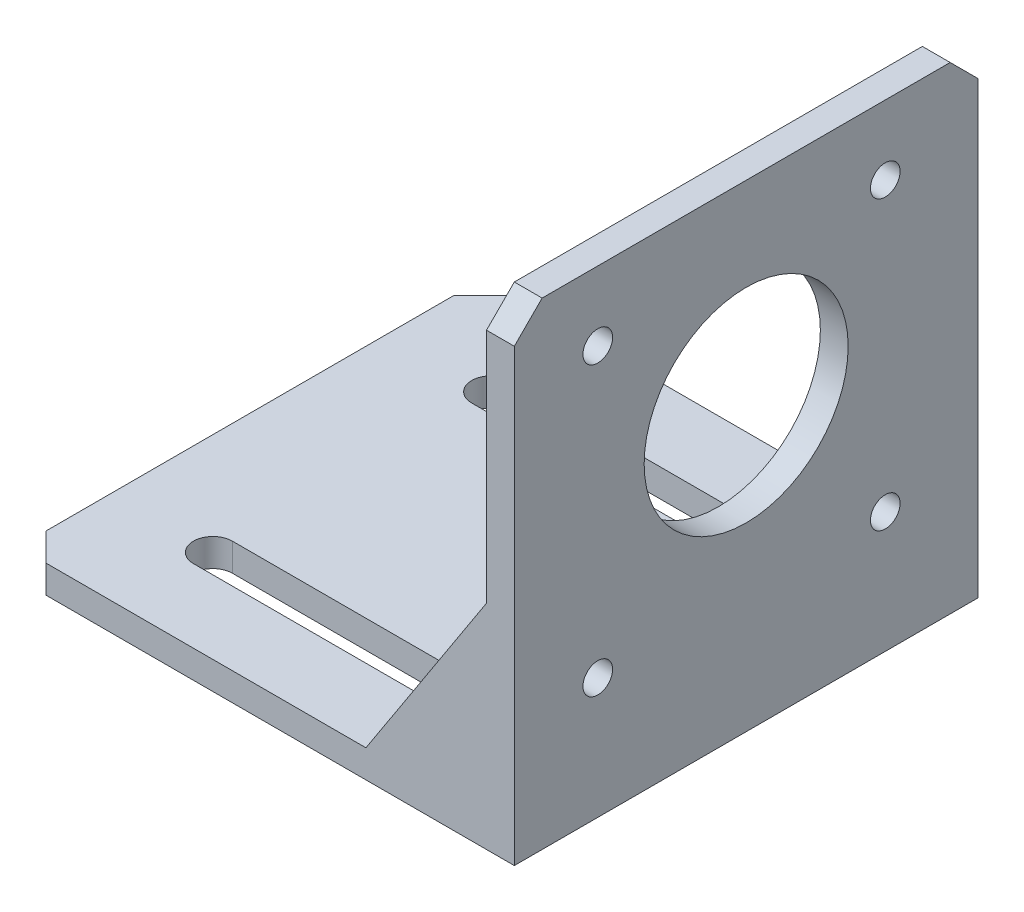
ISO-10303-21;
HEADER;
FILE_DESCRIPTION(('STEP AP214'),'2;1');
FILE_NAME('part.step','',(''),(''),'','','');
FILE_SCHEMA(('AUTOMOTIVE_DESIGN { 1 0 10303 214 1 1 1 1 }'));
ENDSEC;
DATA;
#1=APPLICATION_CONTEXT('core data for automotive mechanical design processes');
#2=APPLICATION_PROTOCOL_DEFINITION('international standard','automotive_design',2000,#1);
#3=PRODUCT_CONTEXT('',#1,'mechanical');
#4=PRODUCT('Part','Part','',(#3));
#5=PRODUCT_RELATED_PRODUCT_CATEGORY('part','',(#4));
#6=PRODUCT_DEFINITION_FORMATION('','',#4);
#7=PRODUCT_DEFINITION_CONTEXT('part definition',#1,'design');
#8=PRODUCT_DEFINITION('design','',#6,#7);
#9=PRODUCT_DEFINITION_SHAPE('','',#8);
#10=(LENGTH_UNIT() NAMED_UNIT(*) SI_UNIT(.MILLI.,.METRE.));
#11=(NAMED_UNIT(*) PLANE_ANGLE_UNIT() SI_UNIT($,.RADIAN.));
#12=(NAMED_UNIT(*) SI_UNIT($,.STERADIAN.) SOLID_ANGLE_UNIT());
#13=UNCERTAINTY_MEASURE_WITH_UNIT(LENGTH_MEASURE(1.E-05),#10,'distance_accuracy_value','');
#14=(GEOMETRIC_REPRESENTATION_CONTEXT(3) GLOBAL_UNCERTAINTY_ASSIGNED_CONTEXT((#13)) GLOBAL_UNIT_ASSIGNED_CONTEXT((#10,
#11,#12)) REPRESENTATION_CONTEXT('',''));
#15=CARTESIAN_POINT('',(0.,0.,0.));
#16=DIRECTION('',(0.,0.,1.));
#17=DIRECTION('',(1.,0.,0.));
#18=AXIS2_PLACEMENT_3D('',#15,#16,#17);
#19=CARTESIAN_POINT('',(0.,0.,50.));
#20=DIRECTION('',(0.,-1.,0.));
#21=DIRECTION('',(0.,0.,-1.));
#22=AXIS2_PLACEMENT_3D('',#19,#20,#21);
#23=PLANE('',#22);
#24=DIRECTION('',(-1.,0.,0.));
#25=VECTOR('',#24,1.);
#26=CARTESIAN_POINT('',(0.,0.,0.));
#27=LINE('',#26,#25);
#28=CARTESIAN_POINT('',(37.5,0.,0.));
#29=VERTEX_POINT('',#28);
#30=CARTESIAN_POINT('',(3.00000000000002,0.,0.));
#31=VERTEX_POINT('',#30);
#32=EDGE_CURVE('E440',#29,#31,#27,.T.);
#33=ORIENTED_EDGE('',*,*,#32,.T.);
#34=DIRECTION('',(-0.707106781186549,0.,0.707106781186546));
#35=VECTOR('',#34,1.);
#36=CARTESIAN_POINT('',(0.,0.,3.));
#37=LINE('',#36,#35);
#38=CARTESIAN_POINT('',(0.,0.,3.));
#39=VERTEX_POINT('',#38);
#40=EDGE_CURVE('E511',#31,#39,#37,.T.);
#41=ORIENTED_EDGE('',*,*,#40,.T.);
#42=DIRECTION('',(0.,0.,-1.));
#43=VECTOR('',#42,1.);
#44=CARTESIAN_POINT('',(0.,0.,50.));
#45=LINE('',#44,#43);
#46=CARTESIAN_POINT('',(0.,0.,47.));
#47=VERTEX_POINT('',#46);
#48=EDGE_CURVE('E443',#47,#39,#45,.T.);
#49=ORIENTED_EDGE('',*,*,#48,.F.);
#50=DIRECTION('',(-0.707106781186546,0.,-0.707106781186549));
#51=VECTOR('',#50,1.);
#52=CARTESIAN_POINT('',(3.,0.,50.));
#53=LINE('',#52,#51);
#54=CARTESIAN_POINT('',(3.,0.,50.));
#55=VERTEX_POINT('',#54);
#56=EDGE_CURVE('E509',#47,#55,#53,.F.);
#57=ORIENTED_EDGE('',*,*,#56,.T.);
#58=DIRECTION('',(-1.,0.,0.));
#59=VECTOR('',#58,1.);
#60=CARTESIAN_POINT('',(0.,0.,50.));
#61=LINE('',#60,#59);
#62=CARTESIAN_POINT('',(37.5,0.,50.));
#63=VERTEX_POINT('',#62);
#64=EDGE_CURVE('E347',#63,#55,#61,.T.);
#65=ORIENTED_EDGE('',*,*,#64,.F.);
#66=DIRECTION('',(0.,0.,-1.));
#67=VECTOR('',#66,1.);
#68=CARTESIAN_POINT('',(37.5,0.,50.));
#69=LINE('',#68,#67);
#70=CARTESIAN_POINT('',(37.5,0.,47.9));
#71=VERTEX_POINT('',#70);
#72=EDGE_CURVE('E356',#63,#71,#69,.T.);
#73=ORIENTED_EDGE('',*,*,#72,.T.);
#74=DIRECTION('',(-1.,0.,0.));
#75=VECTOR('',#74,1.);
#76=CARTESIAN_POINT('',(0.,0.,47.9));
#77=LINE('',#76,#75);
#78=CARTESIAN_POINT('',(50.5,0.,47.9));
#79=VERTEX_POINT('',#78);
#80=EDGE_CURVE('E371',#79,#71,#77,.T.);
#81=ORIENTED_EDGE('',*,*,#80,.F.);
#82=DIRECTION('',(0.,0.,-1.));
#83=VECTOR('',#82,1.);
#84=CARTESIAN_POINT('',(50.5,0.,50.));
#85=LINE('',#84,#83);
#86=CARTESIAN_POINT('',(50.5,0.,2.1));
#87=VERTEX_POINT('',#86);
#88=EDGE_CURVE('E453',#79,#87,#85,.T.);
#89=ORIENTED_EDGE('',*,*,#88,.T.);
#90=DIRECTION('',(1.,0.,0.));
#91=VECTOR('',#90,1.);
#92=CARTESIAN_POINT('',(0.,0.,2.1));
#93=LINE('',#92,#91);
#94=CARTESIAN_POINT('',(37.5,0.,2.1));
#95=VERTEX_POINT('',#94);
#96=EDGE_CURVE('E560',#95,#87,#93,.T.);
#97=ORIENTED_EDGE('',*,*,#96,.F.);
#98=DIRECTION('',(0.,0.,1.));
#99=VECTOR('',#98,1.);
#100=CARTESIAN_POINT('',(37.5,0.,50.));
#101=LINE('',#100,#99);
#102=EDGE_CURVE('E551',#95,#29,#101,.F.);
#103=ORIENTED_EDGE('',*,*,#102,.T.);
#104=EDGE_LOOP('',(#33,#41,#49,#57,#65,#73,#81,#89,#97,#103));
#105=FACE_BOUND('',#104,.T.);
#106=CARTESIAN_POINT('',(41.,0.,40.));
#107=DIRECTION('',(0.,1.,0.));
#108=DIRECTION('',(0.,0.,1.));
#109=AXIS2_PLACEMENT_3D('',#106,#107,#108);
#110=CIRCLE('',#109,2.1);
#111=CARTESIAN_POINT('',(41.,0.,42.1));
#112=VERTEX_POINT('',#111);
#113=CARTESIAN_POINT('',(41.,0.,37.9));
#114=VERTEX_POINT('',#113);
#115=EDGE_CURVE('E406',#112,#114,#110,.T.);
#116=ORIENTED_EDGE('',*,*,#115,.F.);
#117=DIRECTION('',(1.,0.,0.));
#118=VECTOR('',#117,1.);
#119=CARTESIAN_POINT('',(11.,0.,42.1));
#120=LINE('',#119,#118);
#121=CARTESIAN_POINT('',(11.,0.,42.1));
#122=VERTEX_POINT('',#121);
#123=EDGE_CURVE('E393',#122,#112,#120,.T.);
#124=ORIENTED_EDGE('',*,*,#123,.F.);
#125=CARTESIAN_POINT('',(11.,0.,40.));
#126=DIRECTION('',(0.,1.,0.));
#127=DIRECTION('',(0.,0.,1.));
#128=AXIS2_PLACEMENT_3D('',#125,#126,#127);
#129=CIRCLE('',#128,2.1);
#130=CARTESIAN_POINT('',(11.,0.,37.9));
#131=VERTEX_POINT('',#130);
#132=EDGE_CURVE('E398',#131,#122,#129,.T.);
#133=ORIENTED_EDGE('',*,*,#132,.F.);
#134=DIRECTION('',(1.,0.,0.));
#135=VECTOR('',#134,1.);
#136=CARTESIAN_POINT('',(11.,0.,37.9));
#137=LINE('',#136,#135);
#138=EDGE_CURVE('E395',#131,#114,#137,.T.);
#139=ORIENTED_EDGE('',*,*,#138,.T.);
#140=EDGE_LOOP('',(#116,#124,#133,#139));
#141=FACE_BOUND('',#140,.T.);
#142=DIRECTION('',(1.,0.,0.));
#143=VECTOR('',#142,1.);
#144=CARTESIAN_POINT('',(11.,0.,12.1));
#145=LINE('',#144,#143);
#146=CARTESIAN_POINT('',(11.,0.,12.1));
#147=VERTEX_POINT('',#146);
#148=CARTESIAN_POINT('',(41.,0.,12.1));
#149=VERTEX_POINT('',#148);
#150=EDGE_CURVE('E373',#147,#149,#145,.T.);
#151=ORIENTED_EDGE('',*,*,#150,.F.);
#152=CARTESIAN_POINT('',(11.,0.,10.));
#153=DIRECTION('',(0.,1.,0.));
#154=DIRECTION('',(0.,0.,1.));
#155=AXIS2_PLACEMENT_3D('',#152,#153,#154);
#156=CIRCLE('',#155,2.1);
#157=CARTESIAN_POINT('',(11.,0.,7.9));
#158=VERTEX_POINT('',#157);
#159=EDGE_CURVE('E378',#158,#147,#156,.T.);
#160=ORIENTED_EDGE('',*,*,#159,.F.);
#161=DIRECTION('',(1.,0.,0.));
#162=VECTOR('',#161,1.);
#163=CARTESIAN_POINT('',(11.,0.,7.9));
#164=LINE('',#163,#162);
#165=CARTESIAN_POINT('',(41.,0.,7.9));
#166=VERTEX_POINT('',#165);
#167=EDGE_CURVE('E375',#158,#166,#164,.T.);
#168=ORIENTED_EDGE('',*,*,#167,.T.);
#169=CARTESIAN_POINT('',(41.,0.,10.));
#170=DIRECTION('',(0.,1.,0.));
#171=DIRECTION('',(0.,0.,1.));
#172=AXIS2_PLACEMENT_3D('',#169,#170,#171);
#173=CIRCLE('',#172,2.1);
#174=EDGE_CURVE('E386',#149,#166,#173,.T.);
#175=ORIENTED_EDGE('',*,*,#174,.F.);
#176=EDGE_LOOP('',(#151,#160,#168,#175));
#177=FACE_BOUND('',#176,.T.);
#178=ADVANCED_FACE('F186',(#105,#141,#177),#23,.F.);
#179=CARTESIAN_POINT('',(50.5,0.,50.));
#180=DIRECTION('',(1.,0.,0.));
#181=DIRECTION('',(0.,0.,-1.));
#182=AXIS2_PLACEMENT_3D('',#179,#180,#181);
#183=PLANE('',#182);
#184=CARTESIAN_POINT('',(50.5,41.0348020434226,10.));
#185=DIRECTION('',(-1.,0.,0.));
#186=DIRECTION('',(0.,0.,1.));
#187=AXIS2_PLACEMENT_3D('',#184,#185,#186);
#188=CIRCLE('',#187,1.60000000000001);
#189=CARTESIAN_POINT('',(50.5,41.0348020434226,11.6));
#190=VERTEX_POINT('',#189);
#191=EDGE_CURVE('E413',#190,#190,#188,.T.);
#192=ORIENTED_EDGE('',*,*,#191,.F.);
#193=EDGE_LOOP('',(#192));
#194=FACE_BOUND('',#193,.T.);
#195=CARTESIAN_POINT('',(50.5,41.0348020434226,41.));
#196=DIRECTION('',(-1.,0.,0.));
#197=DIRECTION('',(0.,0.,1.));
#198=AXIS2_PLACEMENT_3D('',#195,#196,#197);
#199=CIRCLE('',#198,1.60000000000001);
#200=CARTESIAN_POINT('',(50.5,41.0348020434226,42.6));
#201=VERTEX_POINT('',#200);
#202=EDGE_CURVE('E417',#201,#201,#199,.T.);
#203=ORIENTED_EDGE('',*,*,#202,.F.);
#204=EDGE_LOOP('',(#203));
#205=FACE_BOUND('',#204,.T.);
#206=CARTESIAN_POINT('',(50.5,10.0348020434226,41.));
#207=DIRECTION('',(-1.,0.,0.));
#208=DIRECTION('',(0.,0.,1.));
#209=AXIS2_PLACEMENT_3D('',#206,#207,#208);
#210=CIRCLE('',#209,1.60000000000001);
#211=CARTESIAN_POINT('',(50.5,10.0348020434226,42.6));
#212=VERTEX_POINT('',#211);
#213=EDGE_CURVE('E421',#212,#212,#210,.T.);
#214=ORIENTED_EDGE('',*,*,#213,.F.);
#215=EDGE_LOOP('',(#214));
#216=FACE_BOUND('',#215,.T.);
#217=CARTESIAN_POINT('',(50.5,27.5,25.));
#218=DIRECTION('',(-1.,0.,0.));
#219=DIRECTION('',(0.,0.,1.));
#220=AXIS2_PLACEMENT_3D('',#217,#218,#219);
#221=CIRCLE('',#220,11.);
#222=CARTESIAN_POINT('',(50.5,27.5,36.));
#223=VERTEX_POINT('',#222);
#224=EDGE_CURVE('E431',#223,#223,#221,.T.);
#225=ORIENTED_EDGE('',*,*,#224,.F.);
#226=EDGE_LOOP('',(#225));
#227=FACE_BOUND('',#226,.T.);
#228=DIRECTION('',(0.,0.,-1.));
#229=VECTOR('',#228,1.);
#230=CARTESIAN_POINT('',(50.5,48.5,50.));
#231=LINE('',#230,#229);
#232=CARTESIAN_POINT('',(50.5,48.5,47.));
#233=VERTEX_POINT('',#232);
#234=CARTESIAN_POINT('',(50.5,48.5,3.));
#235=VERTEX_POINT('',#234);
#236=EDGE_CURVE('E456',#233,#235,#231,.T.);
#237=ORIENTED_EDGE('',*,*,#236,.T.);
#238=DIRECTION('',(0.,-0.707106781186549,-0.707106781186546));
#239=VECTOR('',#238,1.);
#240=CARTESIAN_POINT('',(50.5,48.5,3.));
#241=LINE('',#240,#239);
#242=CARTESIAN_POINT('',(50.5,45.5,0.));
#243=VERTEX_POINT('',#242);
#244=EDGE_CURVE('E523',#235,#243,#241,.T.);
#245=ORIENTED_EDGE('',*,*,#244,.T.);
#246=DIRECTION('',(0.,-1.,0.));
#247=VECTOR('',#246,1.);
#248=CARTESIAN_POINT('',(50.5,0.,0.));
#249=LINE('',#248,#247);
#250=CARTESIAN_POINT('',(50.5,20.,0.));
#251=VERTEX_POINT('',#250);
#252=EDGE_CURVE('E447',#243,#251,#249,.T.);
#253=ORIENTED_EDGE('',*,*,#252,.T.);
#254=DIRECTION('',(0.,0.,-1.));
#255=VECTOR('',#254,1.);
#256=CARTESIAN_POINT('',(50.5,20.,50.));
#257=LINE('',#256,#255);
#258=CARTESIAN_POINT('',(50.5,20.,2.1));
#259=VERTEX_POINT('',#258);
#260=EDGE_CURVE('E548',#251,#259,#257,.F.);
#261=ORIENTED_EDGE('',*,*,#260,.T.);
#262=DIRECTION('',(0.,1.,0.));
#263=VECTOR('',#262,1.);
#264=CARTESIAN_POINT('',(50.5,0.,2.1));
#265=LINE('',#264,#263);
#266=EDGE_CURVE('E557',#87,#259,#265,.T.);
#267=ORIENTED_EDGE('',*,*,#266,.F.);
#268=ORIENTED_EDGE('',*,*,#88,.F.);
#269=DIRECTION('',(0.,-1.,0.));
#270=VECTOR('',#269,1.);
#271=CARTESIAN_POINT('',(50.5,0.,47.9));
#272=LINE('',#271,#270);
#273=CARTESIAN_POINT('',(50.5,20.,47.9));
#274=VERTEX_POINT('',#273);
#275=EDGE_CURVE('E365',#274,#79,#272,.T.);
#276=ORIENTED_EDGE('',*,*,#275,.F.);
#277=DIRECTION('',(0.,0.,1.));
#278=VECTOR('',#277,1.);
#279=CARTESIAN_POINT('',(50.5,20.,50.));
#280=LINE('',#279,#278);
#281=CARTESIAN_POINT('',(50.5,20.,50.));
#282=VERTEX_POINT('',#281);
#283=EDGE_CURVE('E353',#274,#282,#280,.T.);
#284=ORIENTED_EDGE('',*,*,#283,.T.);
#285=DIRECTION('',(0.,-1.,0.));
#286=VECTOR('',#285,1.);
#287=CARTESIAN_POINT('',(50.5,0.,50.));
#288=LINE('',#287,#286);
#289=CARTESIAN_POINT('',(50.5,45.5,50.));
#290=VERTEX_POINT('',#289);
#291=EDGE_CURVE('E336',#290,#282,#288,.T.);
#292=ORIENTED_EDGE('',*,*,#291,.F.);
#293=DIRECTION('',(0.,-0.707106781186546,0.707106781186549));
#294=VECTOR('',#293,1.);
#295=CARTESIAN_POINT('',(50.5,45.5,50.));
#296=LINE('',#295,#294);
#297=EDGE_CURVE('E521',#290,#233,#296,.F.);
#298=ORIENTED_EDGE('',*,*,#297,.T.);
#299=EDGE_LOOP('',(#237,#245,#253,#261,#267,#268,#276,#284,#292,#298));
#300=FACE_BOUND('',#299,.T.);
#301=CARTESIAN_POINT('',(50.5,10.0348020434226,10.));
#302=DIRECTION('',(-1.,0.,0.));
#303=DIRECTION('',(0.,0.,1.));
#304=AXIS2_PLACEMENT_3D('',#301,#302,#303);
#305=CIRCLE('',#304,1.60000000000001);
#306=CARTESIAN_POINT('',(50.5,10.0348020434226,11.6));
#307=VERTEX_POINT('',#306);
#308=EDGE_CURVE('E425',#307,#307,#305,.T.);
#309=ORIENTED_EDGE('',*,*,#308,.F.);
#310=EDGE_LOOP('',(#309));
#311=FACE_BOUND('',#310,.T.);
#312=ADVANCED_FACE('F362',(#194,#205,#216,#227,#300,#311),#183,.F.);
#313=CARTESIAN_POINT('',(0.,-3.,50.));
#314=DIRECTION('',(1.,0.,0.));
#315=DIRECTION('',(0.,0.,-1.));
#316=AXIS2_PLACEMENT_3D('',#313,#314,#315);
#317=PLANE('',#316);
#318=ORIENTED_EDGE('',*,*,#48,.T.);
#319=DIRECTION('',(0.,-1.,0.));
#320=VECTOR('',#319,1.);
#321=CARTESIAN_POINT('',(0.,-3.,3.));
#322=LINE('',#321,#320);
#323=CARTESIAN_POINT('',(0.,-3.,3.));
#324=VERTEX_POINT('',#323);
#325=EDGE_CURVE('E498',#39,#324,#322,.T.);
#326=ORIENTED_EDGE('',*,*,#325,.T.);
#327=DIRECTION('',(0.,0.,-1.));
#328=VECTOR('',#327,1.);
#329=CARTESIAN_POINT('',(0.,-3.,50.));
#330=LINE('',#329,#328);
#331=CARTESIAN_POINT('',(0.,-3.,47.));
#332=VERTEX_POINT('',#331);
#333=EDGE_CURVE('E463',#332,#324,#330,.T.);
#334=ORIENTED_EDGE('',*,*,#333,.F.);
#335=DIRECTION('',(0.,1.,0.));
#336=VECTOR('',#335,1.);
#337=CARTESIAN_POINT('',(0.,-3.,47.));
#338=LINE('',#337,#336);
#339=EDGE_CURVE('E496',#332,#47,#338,.T.);
#340=ORIENTED_EDGE('',*,*,#339,.T.);
#341=EDGE_LOOP('',(#318,#326,#334,#340));
#342=FACE_BOUND('',#341,.T.);
#343=ADVANCED_FACE('F578',(#342),#317,.F.);
#344=CARTESIAN_POINT('',(53.5,-2.99999999999999,50.));
#345=DIRECTION('',(0.,1.,0.));
#346=DIRECTION('',(-1.,0.,0.));
#347=AXIS2_PLACEMENT_3D('',#344,#345,#346);
#348=PLANE('',#347);
#349=ORIENTED_EDGE('',*,*,#333,.T.);
#350=DIRECTION('',(0.707106781186549,0.,-0.707106781186546));
#351=VECTOR('',#350,1.);
#352=CARTESIAN_POINT('',(0.,-3.,3.));
#353=LINE('',#352,#351);
#354=CARTESIAN_POINT('',(3.00000000000002,-3.,0.));
#355=VERTEX_POINT('',#354);
#356=EDGE_CURVE('E503',#324,#355,#353,.T.);
#357=ORIENTED_EDGE('',*,*,#356,.T.);
#358=DIRECTION('',(1.,0.,0.));
#359=VECTOR('',#358,1.);
#360=CARTESIAN_POINT('',(53.5,-2.99999999999999,0.));
#361=LINE('',#360,#359);
#362=CARTESIAN_POINT('',(53.5,-2.99999999999999,0.));
#363=VERTEX_POINT('',#362);
#364=EDGE_CURVE('E437',#355,#363,#361,.T.);
#365=ORIENTED_EDGE('',*,*,#364,.T.);
#366=DIRECTION('',(0.,0.,-1.));
#367=VECTOR('',#366,1.);
#368=CARTESIAN_POINT('',(53.5,-2.99999999999999,50.));
#369=LINE('',#368,#367);
#370=CARTESIAN_POINT('',(53.5,-2.99999999999999,50.));
#371=VERTEX_POINT('',#370);
#372=EDGE_CURVE('E460',#371,#363,#369,.T.);
#373=ORIENTED_EDGE('',*,*,#372,.F.);
#374=DIRECTION('',(1.,0.,0.));
#375=VECTOR('',#374,1.);
#376=CARTESIAN_POINT('',(53.5,-2.99999999999999,50.));
#377=LINE('',#376,#375);
#378=CARTESIAN_POINT('',(3.,-3.,50.));
#379=VERTEX_POINT('',#378);
#380=EDGE_CURVE('E438',#379,#371,#377,.T.);
#381=ORIENTED_EDGE('',*,*,#380,.F.);
#382=DIRECTION('',(0.707106781186546,0.,0.707106781186549));
#383=VECTOR('',#382,1.);
#384=CARTESIAN_POINT('',(3.,-3.,50.));
#385=LINE('',#384,#383);
#386=EDGE_CURVE('E501',#379,#332,#385,.F.);
#387=ORIENTED_EDGE('',*,*,#386,.T.);
#388=EDGE_LOOP('',(#349,#357,#365,#373,#381,#387));
#389=FACE_BOUND('',#388,.T.);
#390=CARTESIAN_POINT('',(41.,-3.,10.));
#391=DIRECTION('',(0.,1.,0.));
#392=DIRECTION('',(-1.,0.,0.));
#393=AXIS2_PLACEMENT_3D('',#390,#391,#392);
#394=CIRCLE('',#393,2.1);
#395=CARTESIAN_POINT('',(41.,-3.,12.1));
#396=VERTEX_POINT('',#395);
#397=CARTESIAN_POINT('',(41.,-3.,7.9));
#398=VERTEX_POINT('',#397);
#399=EDGE_CURVE('E490',#396,#398,#394,.T.);
#400=ORIENTED_EDGE('',*,*,#399,.T.);
#401=DIRECTION('',(-1.,0.,0.));
#402=VECTOR('',#401,1.);
#403=CARTESIAN_POINT('',(53.5,-2.99999999999999,7.9));
#404=LINE('',#403,#402);
#405=CARTESIAN_POINT('',(11.,-3.,7.9));
#406=VERTEX_POINT('',#405);
#407=EDGE_CURVE('E493',#398,#406,#404,.T.);
#408=ORIENTED_EDGE('',*,*,#407,.T.);
#409=CARTESIAN_POINT('',(11.,-3.,10.));
#410=DIRECTION('',(0.,1.,0.));
#411=DIRECTION('',(-1.,0.,0.));
#412=AXIS2_PLACEMENT_3D('',#409,#410,#411);
#413=CIRCLE('',#412,2.1);
#414=CARTESIAN_POINT('',(11.,-3.,12.1));
#415=VERTEX_POINT('',#414);
#416=EDGE_CURVE('E487',#406,#415,#413,.T.);
#417=ORIENTED_EDGE('',*,*,#416,.T.);
#418=DIRECTION('',(1.,0.,0.));
#419=VECTOR('',#418,1.);
#420=CARTESIAN_POINT('',(53.5,-2.99999999999999,12.1));
#421=LINE('',#420,#419);
#422=EDGE_CURVE('E484',#415,#396,#421,.T.);
#423=ORIENTED_EDGE('',*,*,#422,.T.);
#424=EDGE_LOOP('',(#400,#408,#417,#423));
#425=FACE_BOUND('',#424,.T.);
#426=CARTESIAN_POINT('',(41.,-3.,40.));
#427=DIRECTION('',(0.,1.,0.));
#428=DIRECTION('',(-1.,0.,0.));
#429=AXIS2_PLACEMENT_3D('',#426,#427,#428);
#430=CIRCLE('',#429,2.1);
#431=CARTESIAN_POINT('',(41.,-3.,42.1));
#432=VERTEX_POINT('',#431);
#433=CARTESIAN_POINT('',(41.,-3.,37.9));
#434=VERTEX_POINT('',#433);
#435=EDGE_CURVE('E478',#432,#434,#430,.T.);
#436=ORIENTED_EDGE('',*,*,#435,.T.);
#437=DIRECTION('',(-1.,0.,0.));
#438=VECTOR('',#437,1.);
#439=CARTESIAN_POINT('',(53.5,-2.99999999999999,37.9));
#440=LINE('',#439,#438);
#441=CARTESIAN_POINT('',(11.,-3.,37.9));
#442=VERTEX_POINT('',#441);
#443=EDGE_CURVE('E481',#434,#442,#440,.T.);
#444=ORIENTED_EDGE('',*,*,#443,.T.);
#445=CARTESIAN_POINT('',(11.,-3.,40.));
#446=DIRECTION('',(0.,1.,0.));
#447=DIRECTION('',(-1.,0.,0.));
#448=AXIS2_PLACEMENT_3D('',#445,#446,#447);
#449=CIRCLE('',#448,2.1);
#450=CARTESIAN_POINT('',(11.,-3.,42.1));
#451=VERTEX_POINT('',#450);
#452=EDGE_CURVE('E475',#442,#451,#449,.T.);
#453=ORIENTED_EDGE('',*,*,#452,.T.);
#454=DIRECTION('',(1.,0.,0.));
#455=VECTOR('',#454,1.);
#456=CARTESIAN_POINT('',(53.5,-2.99999999999999,42.1));
#457=LINE('',#456,#455);
#458=EDGE_CURVE('E466',#451,#432,#457,.T.);
#459=ORIENTED_EDGE('',*,*,#458,.T.);
#460=EDGE_LOOP('',(#436,#444,#453,#459));
#461=FACE_BOUND('',#460,.T.);
#462=ADVANCED_FACE('F575',(#389,#425,#461),#348,.F.);
#463=CARTESIAN_POINT('',(53.5,48.5,50.));
#464=DIRECTION('',(-1.,0.,0.));
#465=DIRECTION('',(0.,-1.,0.));
#466=AXIS2_PLACEMENT_3D('',#463,#464,#465);
#467=PLANE('',#466);
#468=DIRECTION('',(0.,1.,0.));
#469=VECTOR('',#468,1.);
#470=CARTESIAN_POINT('',(53.5,48.5,0.));
#471=LINE('',#470,#469);
#472=CARTESIAN_POINT('',(53.5,45.5,0.));
#473=VERTEX_POINT('',#472);
#474=EDGE_CURVE('E445',#363,#473,#471,.T.);
#475=ORIENTED_EDGE('',*,*,#474,.T.);
#476=DIRECTION('',(0.,0.707106781186549,0.707106781186546));
#477=VECTOR('',#476,1.);
#478=CARTESIAN_POINT('',(53.5,48.5,3.));
#479=LINE('',#478,#477);
#480=CARTESIAN_POINT('',(53.5,48.5,3.));
#481=VERTEX_POINT('',#480);
#482=EDGE_CURVE('E13',#473,#481,#479,.T.);
#483=ORIENTED_EDGE('',*,*,#482,.T.);
#484=DIRECTION('',(0.,0.,-1.));
#485=VECTOR('',#484,1.);
#486=CARTESIAN_POINT('',(53.5,48.5,50.));
#487=LINE('',#486,#485);
#488=CARTESIAN_POINT('',(53.5,48.5,47.));
#489=VERTEX_POINT('',#488);
#490=EDGE_CURVE('E458',#489,#481,#487,.T.);
#491=ORIENTED_EDGE('',*,*,#490,.F.);
#492=DIRECTION('',(0.,0.707106781186546,-0.707106781186549));
#493=VECTOR('',#492,1.);
#494=CARTESIAN_POINT('',(53.5,45.5,50.));
#495=LINE('',#494,#493);
#496=CARTESIAN_POINT('',(53.5,45.5,50.));
#497=VERTEX_POINT('',#496);
#498=EDGE_CURVE('E195',#489,#497,#495,.F.);
#499=ORIENTED_EDGE('',*,*,#498,.T.);
#500=DIRECTION('',(0.,1.,0.));
#501=VECTOR('',#500,1.);
#502=CARTESIAN_POINT('',(53.5,48.5,50.));
#503=LINE('',#502,#501);
#504=EDGE_CURVE('E348',#371,#497,#503,.T.);
#505=ORIENTED_EDGE('',*,*,#504,.F.);
#506=ORIENTED_EDGE('',*,*,#372,.T.);
#507=EDGE_LOOP('',(#475,#483,#491,#499,#505,#506));
#508=FACE_BOUND('',#507,.T.);
#509=CARTESIAN_POINT('',(53.5,41.0348020434226,10.));
#510=DIRECTION('',(-1.,0.,0.));
#511=DIRECTION('',(0.,-1.,0.));
#512=AXIS2_PLACEMENT_3D('',#509,#510,#511);
#513=CIRCLE('',#512,1.60000000000001);
#514=CARTESIAN_POINT('',(53.5,39.4348020434226,10.));
#515=VERTEX_POINT('',#514);
#516=EDGE_CURVE('E416',#515,#515,#513,.T.);
#517=ORIENTED_EDGE('',*,*,#516,.T.);
#518=EDGE_LOOP('',(#517));
#519=FACE_BOUND('',#518,.T.);
#520=CARTESIAN_POINT('',(53.5,41.0348020434226,41.));
#521=DIRECTION('',(-1.,0.,0.));
#522=DIRECTION('',(0.,-1.,0.));
#523=AXIS2_PLACEMENT_3D('',#520,#521,#522);
#524=CIRCLE('',#523,1.60000000000001);
#525=CARTESIAN_POINT('',(53.5,39.4348020434226,41.));
#526=VERTEX_POINT('',#525);
#527=EDGE_CURVE('E420',#526,#526,#524,.T.);
#528=ORIENTED_EDGE('',*,*,#527,.T.);
#529=EDGE_LOOP('',(#528));
#530=FACE_BOUND('',#529,.T.);
#531=CARTESIAN_POINT('',(53.5,10.0348020434226,41.));
#532=DIRECTION('',(-1.,0.,0.));
#533=DIRECTION('',(0.,-1.,0.));
#534=AXIS2_PLACEMENT_3D('',#531,#532,#533);
#535=CIRCLE('',#534,1.60000000000001);
#536=CARTESIAN_POINT('',(53.5,8.43480204342257,41.));
#537=VERTEX_POINT('',#536);
#538=EDGE_CURVE('E424',#537,#537,#535,.T.);
#539=ORIENTED_EDGE('',*,*,#538,.T.);
#540=EDGE_LOOP('',(#539));
#541=FACE_BOUND('',#540,.T.);
#542=CARTESIAN_POINT('',(53.5,10.0348020434226,10.));
#543=DIRECTION('',(-1.,0.,0.));
#544=DIRECTION('',(0.,-1.,0.));
#545=AXIS2_PLACEMENT_3D('',#542,#543,#544);
#546=CIRCLE('',#545,1.60000000000001);
#547=CARTESIAN_POINT('',(53.5,8.43480204342256,10.));
#548=VERTEX_POINT('',#547);
#549=EDGE_CURVE('E428',#548,#548,#546,.T.);
#550=ORIENTED_EDGE('',*,*,#549,.T.);
#551=EDGE_LOOP('',(#550));
#552=FACE_BOUND('',#551,.T.);
#553=CARTESIAN_POINT('',(53.5,27.5,25.));
#554=DIRECTION('',(-1.,0.,0.));
#555=DIRECTION('',(0.,-1.,0.));
#556=AXIS2_PLACEMENT_3D('',#553,#554,#555);
#557=CIRCLE('',#556,11.);
#558=CARTESIAN_POINT('',(53.5,16.5,25.));
#559=VERTEX_POINT('',#558);
#560=EDGE_CURVE('E434',#559,#559,#557,.T.);
#561=ORIENTED_EDGE('',*,*,#560,.T.);
#562=EDGE_LOOP('',(#561));
#563=FACE_BOUND('',#562,.T.);
#564=ADVANCED_FACE('F526',(#508,#519,#530,#541,#552,#563),#467,.F.);
#565=CARTESIAN_POINT('',(50.5,48.5,50.));
#566=DIRECTION('',(0.,-1.,0.));
#567=DIRECTION('',(0.,0.,-1.));
#568=AXIS2_PLACEMENT_3D('',#565,#566,#567);
#569=PLANE('',#568);
#570=ORIENTED_EDGE('',*,*,#490,.T.);
#571=DIRECTION('',(-1.,0.,0.));
#572=VECTOR('',#571,1.);
#573=CARTESIAN_POINT('',(50.5,48.5,3.));
#574=LINE('',#573,#572);
#575=EDGE_CURVE('E518',#481,#235,#574,.T.);
#576=ORIENTED_EDGE('',*,*,#575,.T.);
#577=ORIENTED_EDGE('',*,*,#236,.F.);
#578=DIRECTION('',(1.,0.,0.));
#579=VECTOR('',#578,1.);
#580=CARTESIAN_POINT('',(50.5,48.5,47.));
#581=LINE('',#580,#579);
#582=EDGE_CURVE('E207',#233,#489,#581,.T.);
#583=ORIENTED_EDGE('',*,*,#582,.T.);
#584=EDGE_LOOP('',(#570,#576,#577,#583));
#585=FACE_BOUND('',#584,.T.);
#586=ADVANCED_FACE('F531',(#585),#569,.F.);
#587=CARTESIAN_POINT('',(0.,0.,50.));
#588=DIRECTION('',(0.,0.,-1.));
#589=DIRECTION('',(-1.,0.,0.));
#590=AXIS2_PLACEMENT_3D('',#587,#588,#589);
#591=PLANE('',#590);
#592=ORIENTED_EDGE('',*,*,#64,.T.);
#593=DIRECTION('',(0.,-1.,0.));
#594=VECTOR('',#593,1.);
#595=CARTESIAN_POINT('',(3.,0.,50.));
#596=LINE('',#595,#594);
#597=EDGE_CURVE('E514',#55,#379,#596,.T.);
#598=ORIENTED_EDGE('',*,*,#597,.T.);
#599=ORIENTED_EDGE('',*,*,#380,.T.);
#600=ORIENTED_EDGE('',*,*,#504,.T.);
#601=DIRECTION('',(-1.,0.,0.));
#602=VECTOR('',#601,1.);
#603=CARTESIAN_POINT('',(0.,45.5,50.));
#604=LINE('',#603,#602);
#605=EDGE_CURVE('E344',#497,#290,#604,.T.);
#606=ORIENTED_EDGE('',*,*,#605,.T.);
#607=ORIENTED_EDGE('',*,*,#291,.T.);
#608=DIRECTION('',(-0.544988350595414,-0.838443616300637,0.));
#609=VECTOR('',#608,1.);
#610=CARTESIAN_POINT('',(50.5,20.,50.));
#611=LINE('',#610,#609);
#612=EDGE_CURVE('E340',#282,#63,#611,.T.);
#613=ORIENTED_EDGE('',*,*,#612,.T.);
#614=EDGE_LOOP('',(#592,#598,#599,#600,#606,#607,#613));
#615=FACE_BOUND('',#614,.T.);
#616=ADVANCED_FACE('F339',(#615),#591,.F.);
#617=CARTESIAN_POINT('',(0.,0.,0.));
#618=DIRECTION('',(0.,0.,-1.));
#619=DIRECTION('',(-1.,0.,0.));
#620=AXIS2_PLACEMENT_3D('',#617,#618,#619);
#621=PLANE('',#620);
#622=ORIENTED_EDGE('',*,*,#364,.F.);
#623=DIRECTION('',(0.,1.,0.));
#624=VECTOR('',#623,1.);
#625=CARTESIAN_POINT('',(3.00000000000002,0.,0.));
#626=LINE('',#625,#624);
#627=EDGE_CURVE('E507',#355,#31,#626,.T.);
#628=ORIENTED_EDGE('',*,*,#627,.T.);
#629=ORIENTED_EDGE('',*,*,#32,.F.);
#630=DIRECTION('',(-0.544988350595414,-0.838443616300637,0.));
#631=VECTOR('',#630,1.);
#632=CARTESIAN_POINT('',(50.5,20.,0.));
#633=LINE('',#632,#631);
#634=EDGE_CURVE('E545',#251,#29,#633,.T.);
#635=ORIENTED_EDGE('',*,*,#634,.F.);
#636=ORIENTED_EDGE('',*,*,#252,.F.);
#637=DIRECTION('',(1.,0.,0.));
#638=VECTOR('',#637,1.);
#639=CARTESIAN_POINT('',(53.5,45.5,0.));
#640=LINE('',#639,#638);
#641=EDGE_CURVE('E505',#243,#473,#640,.T.);
#642=ORIENTED_EDGE('',*,*,#641,.T.);
#643=ORIENTED_EDGE('',*,*,#474,.F.);
#644=EDGE_LOOP('',(#622,#628,#629,#635,#636,#642,#643));
#645=FACE_BOUND('',#644,.T.);
#646=ADVANCED_FACE('F541',(#645),#621,.T.);
#647=CARTESIAN_POINT('',(50.5,27.5,25.));
#648=DIRECTION('',(-1.,0.,0.));
#649=DIRECTION('',(0.,0.,1.));
#650=AXIS2_PLACEMENT_3D('',#647,#648,#649);
#651=CYLINDRICAL_SURFACE('',#650,11.);
#652=ORIENTED_EDGE('',*,*,#224,.T.);
#653=EDGE_LOOP('',(#652));
#654=FACE_BOUND('',#653,.T.);
#655=ORIENTED_EDGE('',*,*,#560,.F.);
#656=EDGE_LOOP('',(#655));
#657=FACE_BOUND('',#656,.T.);
#658=ADVANCED_FACE('F658',(#654,#657),#651,.F.);
#659=CARTESIAN_POINT('',(50.5,10.0348020434226,10.));
#660=DIRECTION('',(-1.,0.,0.));
#661=DIRECTION('',(0.,0.,1.));
#662=AXIS2_PLACEMENT_3D('',#659,#660,#661);
#663=CYLINDRICAL_SURFACE('',#662,1.60000000000001);
#664=ORIENTED_EDGE('',*,*,#308,.T.);
#665=EDGE_LOOP('',(#664));
#666=FACE_BOUND('',#665,.T.);
#667=ORIENTED_EDGE('',*,*,#549,.F.);
#668=EDGE_LOOP('',(#667));
#669=FACE_BOUND('',#668,.T.);
#670=ADVANCED_FACE('F836',(#666,#669),#663,.F.);
#671=CARTESIAN_POINT('',(50.5,10.0348020434226,41.));
#672=DIRECTION('',(-1.,0.,0.));
#673=DIRECTION('',(0.,0.,1.));
#674=AXIS2_PLACEMENT_3D('',#671,#672,#673);
#675=CYLINDRICAL_SURFACE('',#674,1.60000000000001);
#676=ORIENTED_EDGE('',*,*,#213,.T.);
#677=EDGE_LOOP('',(#676));
#678=FACE_BOUND('',#677,.T.);
#679=ORIENTED_EDGE('',*,*,#538,.F.);
#680=EDGE_LOOP('',(#679));
#681=FACE_BOUND('',#680,.T.);
#682=ADVANCED_FACE('F826',(#678,#681),#675,.F.);
#683=CARTESIAN_POINT('',(50.5,41.0348020434226,41.));
#684=DIRECTION('',(-1.,0.,0.));
#685=DIRECTION('',(0.,0.,1.));
#686=AXIS2_PLACEMENT_3D('',#683,#684,#685);
#687=CYLINDRICAL_SURFACE('',#686,1.60000000000001);
#688=ORIENTED_EDGE('',*,*,#202,.T.);
#689=EDGE_LOOP('',(#688));
#690=FACE_BOUND('',#689,.T.);
#691=ORIENTED_EDGE('',*,*,#527,.F.);
#692=EDGE_LOOP('',(#691));
#693=FACE_BOUND('',#692,.T.);
#694=ADVANCED_FACE('F816',(#690,#693),#687,.F.);
#695=CARTESIAN_POINT('',(50.5,41.0348020434226,10.));
#696=DIRECTION('',(-1.,0.,0.));
#697=DIRECTION('',(0.,0.,1.));
#698=AXIS2_PLACEMENT_3D('',#695,#696,#697);
#699=CYLINDRICAL_SURFACE('',#698,1.60000000000001);
#700=ORIENTED_EDGE('',*,*,#191,.T.);
#701=EDGE_LOOP('',(#700));
#702=FACE_BOUND('',#701,.T.);
#703=ORIENTED_EDGE('',*,*,#516,.F.);
#704=EDGE_LOOP('',(#703));
#705=FACE_BOUND('',#704,.T.);
#706=ADVANCED_FACE('F807',(#702,#705),#699,.F.);
#707=CARTESIAN_POINT('',(41.,0.,40.));
#708=DIRECTION('',(0.,1.,0.));
#709=DIRECTION('',(0.,0.,1.));
#710=AXIS2_PLACEMENT_3D('',#707,#708,#709);
#711=CYLINDRICAL_SURFACE('',#710,2.1);
#712=DIRECTION('',(0.,1.,0.));
#713=VECTOR('',#712,1.);
#714=CARTESIAN_POINT('',(41.,0.,42.1));
#715=LINE('',#714,#713);
#716=EDGE_CURVE('E411',#112,#432,#715,.F.);
#717=ORIENTED_EDGE('',*,*,#716,.F.);
#718=ORIENTED_EDGE('',*,*,#115,.T.);
#719=DIRECTION('',(0.,1.,0.));
#720=VECTOR('',#719,1.);
#721=CARTESIAN_POINT('',(41.,0.,37.9));
#722=LINE('',#721,#720);
#723=EDGE_CURVE('E409',#434,#114,#722,.T.);
#724=ORIENTED_EDGE('',*,*,#723,.F.);
#725=ORIENTED_EDGE('',*,*,#435,.F.);
#726=EDGE_LOOP('',(#717,#718,#724,#725));
#727=FACE_BOUND('',#726,.T.);
#728=ADVANCED_FACE('F798',(#727),#711,.F.);
#729=CARTESIAN_POINT('',(11.,0.,40.));
#730=DIRECTION('',(0.,1.,0.));
#731=DIRECTION('',(0.,0.,1.));
#732=AXIS2_PLACEMENT_3D('',#729,#730,#731);
#733=CYLINDRICAL_SURFACE('',#732,2.1);
#734=DIRECTION('',(0.,1.,0.));
#735=VECTOR('',#734,1.);
#736=CARTESIAN_POINT('',(11.,0.,37.9));
#737=LINE('',#736,#735);
#738=EDGE_CURVE('E403',#131,#442,#737,.F.);
#739=ORIENTED_EDGE('',*,*,#738,.F.);
#740=ORIENTED_EDGE('',*,*,#132,.T.);
#741=DIRECTION('',(0.,1.,0.));
#742=VECTOR('',#741,1.);
#743=CARTESIAN_POINT('',(11.,0.,42.1));
#744=LINE('',#743,#742);
#745=EDGE_CURVE('E401',#451,#122,#744,.T.);
#746=ORIENTED_EDGE('',*,*,#745,.F.);
#747=ORIENTED_EDGE('',*,*,#452,.F.);
#748=EDGE_LOOP('',(#739,#740,#746,#747));
#749=FACE_BOUND('',#748,.T.);
#750=ADVANCED_FACE('F788',(#749),#733,.F.);
#751=CARTESIAN_POINT('',(11.,0.,37.9));
#752=DIRECTION('',(0.,0.,-1.));
#753=DIRECTION('',(-1.,0.,0.));
#754=AXIS2_PLACEMENT_3D('',#751,#752,#753);
#755=PLANE('',#754);
#756=ORIENTED_EDGE('',*,*,#723,.T.);
#757=ORIENTED_EDGE('',*,*,#138,.F.);
#758=ORIENTED_EDGE('',*,*,#738,.T.);
#759=ORIENTED_EDGE('',*,*,#443,.F.);
#760=EDGE_LOOP('',(#756,#757,#758,#759));
#761=FACE_BOUND('',#760,.T.);
#762=ADVANCED_FACE('F778',(#761),#755,.F.);
#763=CARTESIAN_POINT('',(11.,0.,42.1));
#764=DIRECTION('',(0.,0.,1.));
#765=DIRECTION('',(1.,0.,0.));
#766=AXIS2_PLACEMENT_3D('',#763,#764,#765);
#767=PLANE('',#766);
#768=ORIENTED_EDGE('',*,*,#745,.T.);
#769=ORIENTED_EDGE('',*,*,#123,.T.);
#770=ORIENTED_EDGE('',*,*,#716,.T.);
#771=ORIENTED_EDGE('',*,*,#458,.F.);
#772=EDGE_LOOP('',(#768,#769,#770,#771));
#773=FACE_BOUND('',#772,.T.);
#774=ADVANCED_FACE('F768',(#773),#767,.F.);
#775=CARTESIAN_POINT('',(41.,0.,10.));
#776=DIRECTION('',(0.,1.,0.));
#777=DIRECTION('',(0.,0.,1.));
#778=AXIS2_PLACEMENT_3D('',#775,#776,#777);
#779=CYLINDRICAL_SURFACE('',#778,2.1);
#780=DIRECTION('',(0.,1.,0.));
#781=VECTOR('',#780,1.);
#782=CARTESIAN_POINT('',(41.,0.,12.1));
#783=LINE('',#782,#781);
#784=EDGE_CURVE('E391',#149,#396,#783,.F.);
#785=ORIENTED_EDGE('',*,*,#784,.F.);
#786=ORIENTED_EDGE('',*,*,#174,.T.);
#787=DIRECTION('',(0.,1.,0.));
#788=VECTOR('',#787,1.);
#789=CARTESIAN_POINT('',(41.,0.,7.9));
#790=LINE('',#789,#788);
#791=EDGE_CURVE('E389',#398,#166,#790,.T.);
#792=ORIENTED_EDGE('',*,*,#791,.F.);
#793=ORIENTED_EDGE('',*,*,#399,.F.);
#794=EDGE_LOOP('',(#785,#786,#792,#793));
#795=FACE_BOUND('',#794,.T.);
#796=ADVANCED_FACE('F758',(#795),#779,.F.);
#797=CARTESIAN_POINT('',(11.,0.,10.));
#798=DIRECTION('',(0.,1.,0.));
#799=DIRECTION('',(0.,0.,1.));
#800=AXIS2_PLACEMENT_3D('',#797,#798,#799);
#801=CYLINDRICAL_SURFACE('',#800,2.1);
#802=DIRECTION('',(0.,1.,0.));
#803=VECTOR('',#802,1.);
#804=CARTESIAN_POINT('',(11.,0.,7.9));
#805=LINE('',#804,#803);
#806=EDGE_CURVE('E383',#158,#406,#805,.F.);
#807=ORIENTED_EDGE('',*,*,#806,.F.);
#808=ORIENTED_EDGE('',*,*,#159,.T.);
#809=DIRECTION('',(0.,1.,0.));
#810=VECTOR('',#809,1.);
#811=CARTESIAN_POINT('',(11.,0.,12.1));
#812=LINE('',#811,#810);
#813=EDGE_CURVE('E381',#415,#147,#812,.T.);
#814=ORIENTED_EDGE('',*,*,#813,.F.);
#815=ORIENTED_EDGE('',*,*,#416,.F.);
#816=EDGE_LOOP('',(#807,#808,#814,#815));
#817=FACE_BOUND('',#816,.T.);
#818=ADVANCED_FACE('F748',(#817),#801,.F.);
#819=CARTESIAN_POINT('',(11.,0.,7.9));
#820=DIRECTION('',(0.,0.,-1.));
#821=DIRECTION('',(-1.,0.,0.));
#822=AXIS2_PLACEMENT_3D('',#819,#820,#821);
#823=PLANE('',#822);
#824=ORIENTED_EDGE('',*,*,#791,.T.);
#825=ORIENTED_EDGE('',*,*,#167,.F.);
#826=ORIENTED_EDGE('',*,*,#806,.T.);
#827=ORIENTED_EDGE('',*,*,#407,.F.);
#828=EDGE_LOOP('',(#824,#825,#826,#827));
#829=FACE_BOUND('',#828,.T.);
#830=ADVANCED_FACE('F738',(#829),#823,.F.);
#831=CARTESIAN_POINT('',(11.,0.,12.1));
#832=DIRECTION('',(0.,0.,1.));
#833=DIRECTION('',(1.,0.,0.));
#834=AXIS2_PLACEMENT_3D('',#831,#832,#833);
#835=PLANE('',#834);
#836=ORIENTED_EDGE('',*,*,#813,.T.);
#837=ORIENTED_EDGE('',*,*,#150,.T.);
#838=ORIENTED_EDGE('',*,*,#784,.T.);
#839=ORIENTED_EDGE('',*,*,#422,.F.);
#840=EDGE_LOOP('',(#836,#837,#838,#839));
#841=FACE_BOUND('',#840,.T.);
#842=ADVANCED_FACE('F730',(#841),#835,.F.);
#843=CARTESIAN_POINT('',(26.75,22.75,47.9));
#844=DIRECTION('',(0.,0.,1.));
#845=DIRECTION('',(1.,0.,0.));
#846=AXIS2_PLACEMENT_3D('',#843,#844,#845);
#847=PLANE('',#846);
#848=ORIENTED_EDGE('',*,*,#275,.T.);
#849=ORIENTED_EDGE('',*,*,#80,.T.);
#850=DIRECTION('',(-0.544988350595414,-0.838443616300637,0.));
#851=VECTOR('',#850,1.);
#852=CARTESIAN_POINT('',(50.5,20.,47.9));
#853=LINE('',#852,#851);
#854=EDGE_CURVE('E358',#274,#71,#853,.T.);
#855=ORIENTED_EDGE('',*,*,#854,.F.);
#856=EDGE_LOOP('',(#848,#849,#855));
#857=FACE_BOUND('',#856,.T.);
#858=ADVANCED_FACE('F594',(#857),#847,.F.);
#859=CARTESIAN_POINT('',(50.5,20.,50.));
#860=DIRECTION('',(-0.838443616300637,0.544988350595414,0.));
#861=DIRECTION('',(-0.544988350595414,-0.838443616300637,0.));
#862=AXIS2_PLACEMENT_3D('',#859,#860,#861);
#863=PLANE('',#862);
#864=ORIENTED_EDGE('',*,*,#72,.F.);
#865=ORIENTED_EDGE('',*,*,#612,.F.);
#866=ORIENTED_EDGE('',*,*,#283,.F.);
#867=ORIENTED_EDGE('',*,*,#854,.T.);
#868=EDGE_LOOP('',(#864,#865,#866,#867));
#869=FACE_BOUND('',#868,.T.);
#870=ADVANCED_FACE('F351',(#869),#863,.T.);
#871=CARTESIAN_POINT('',(26.75,22.75,2.1));
#872=DIRECTION('',(0.,0.,-1.));
#873=DIRECTION('',(-1.,0.,0.));
#874=AXIS2_PLACEMENT_3D('',#871,#872,#873);
#875=PLANE('',#874);
#876=DIRECTION('',(-0.544988350595414,-0.838443616300637,0.));
#877=VECTOR('',#876,1.);
#878=CARTESIAN_POINT('',(50.5,20.,2.1));
#879=LINE('',#878,#877);
#880=EDGE_CURVE('E549',#259,#95,#879,.T.);
#881=ORIENTED_EDGE('',*,*,#880,.T.);
#882=ORIENTED_EDGE('',*,*,#96,.T.);
#883=ORIENTED_EDGE('',*,*,#266,.T.);
#884=EDGE_LOOP('',(#881,#882,#883));
#885=FACE_BOUND('',#884,.T.);
#886=ADVANCED_FACE('F586',(#885),#875,.F.);
#887=CARTESIAN_POINT('',(50.5,20.,0.));
#888=DIRECTION('',(0.838443616300637,-0.544988350595414,0.));
#889=DIRECTION('',(-0.544988350595414,-0.838443616300637,0.));
#890=AXIS2_PLACEMENT_3D('',#887,#888,#889);
#891=PLANE('',#890);
#892=ORIENTED_EDGE('',*,*,#102,.F.);
#893=ORIENTED_EDGE('',*,*,#880,.F.);
#894=ORIENTED_EDGE('',*,*,#260,.F.);
#895=ORIENTED_EDGE('',*,*,#634,.T.);
#896=EDGE_LOOP('',(#892,#893,#894,#895));
#897=FACE_BOUND('',#896,.T.);
#898=ADVANCED_FACE('F585',(#897),#891,.F.);
#899=CARTESIAN_POINT('',(0.,-3.,3.));
#900=DIRECTION('',(-0.707106781186546,0.,-0.707106781186549));
#901=DIRECTION('',(0.,1.,0.));
#902=AXIS2_PLACEMENT_3D('',#899,#900,#901);
#903=PLANE('',#902);
#904=ORIENTED_EDGE('',*,*,#40,.F.);
#905=ORIENTED_EDGE('',*,*,#627,.F.);
#906=ORIENTED_EDGE('',*,*,#356,.F.);
#907=ORIENTED_EDGE('',*,*,#325,.F.);
#908=EDGE_LOOP('',(#904,#905,#906,#907));
#909=FACE_BOUND('',#908,.T.);
#910=ADVANCED_FACE('F582',(#909),#903,.T.);
#911=CARTESIAN_POINT('',(3.,0.,50.));
#912=DIRECTION('',(0.707106781186549,0.,-0.707106781186546));
#913=DIRECTION('',(0.,-1.,0.));
#914=AXIS2_PLACEMENT_3D('',#911,#912,#913);
#915=PLANE('',#914);
#916=ORIENTED_EDGE('',*,*,#56,.F.);
#917=ORIENTED_EDGE('',*,*,#339,.F.);
#918=ORIENTED_EDGE('',*,*,#386,.F.);
#919=ORIENTED_EDGE('',*,*,#597,.F.);
#920=EDGE_LOOP('',(#916,#917,#918,#919));
#921=FACE_BOUND('',#920,.T.);
#922=ADVANCED_FACE('F571',(#921),#915,.F.);
#923=CARTESIAN_POINT('',(50.5,48.5,3.));
#924=DIRECTION('',(0.,0.707106781186546,-0.707106781186549));
#925=DIRECTION('',(1.,0.,0.));
#926=AXIS2_PLACEMENT_3D('',#923,#924,#925);
#927=PLANE('',#926);
#928=ORIENTED_EDGE('',*,*,#482,.F.);
#929=ORIENTED_EDGE('',*,*,#641,.F.);
#930=ORIENTED_EDGE('',*,*,#244,.F.);
#931=ORIENTED_EDGE('',*,*,#575,.F.);
#932=EDGE_LOOP('',(#928,#929,#930,#931));
#933=FACE_BOUND('',#932,.T.);
#934=ADVANCED_FACE('F534',(#933),#927,.T.);
#935=CARTESIAN_POINT('',(0.,45.5,50.));
#936=DIRECTION('',(0.,-0.707106781186549,-0.707106781186546));
#937=DIRECTION('',(-1.,0.,0.));
#938=AXIS2_PLACEMENT_3D('',#935,#936,#937);
#939=PLANE('',#938);
#940=ORIENTED_EDGE('',*,*,#498,.F.);
#941=ORIENTED_EDGE('',*,*,#582,.F.);
#942=ORIENTED_EDGE('',*,*,#297,.F.);
#943=ORIENTED_EDGE('',*,*,#605,.F.);
#944=EDGE_LOOP('',(#940,#941,#942,#943));
#945=FACE_BOUND('',#944,.T.);
#946=ADVANCED_FACE('F189',(#945),#939,.F.);
#947=CLOSED_SHELL('',(#178,#312,#343,#462,#564,#586,#616,#646,#658,#670,#682,#694,#706,#728,
#750,#762,#774,#796,#818,#830,#842,#858,#870,#886,#898,#910,#922,#934,#946));
#948=MANIFOLD_SOLID_BREP('B2',#947);
#949=ADVANCED_BREP_SHAPE_REPRESENTATION('',(#18,#948),#14);
#950=SHAPE_DEFINITION_REPRESENTATION(#9,#949);
ENDSEC;
END-ISO-10303-21;
